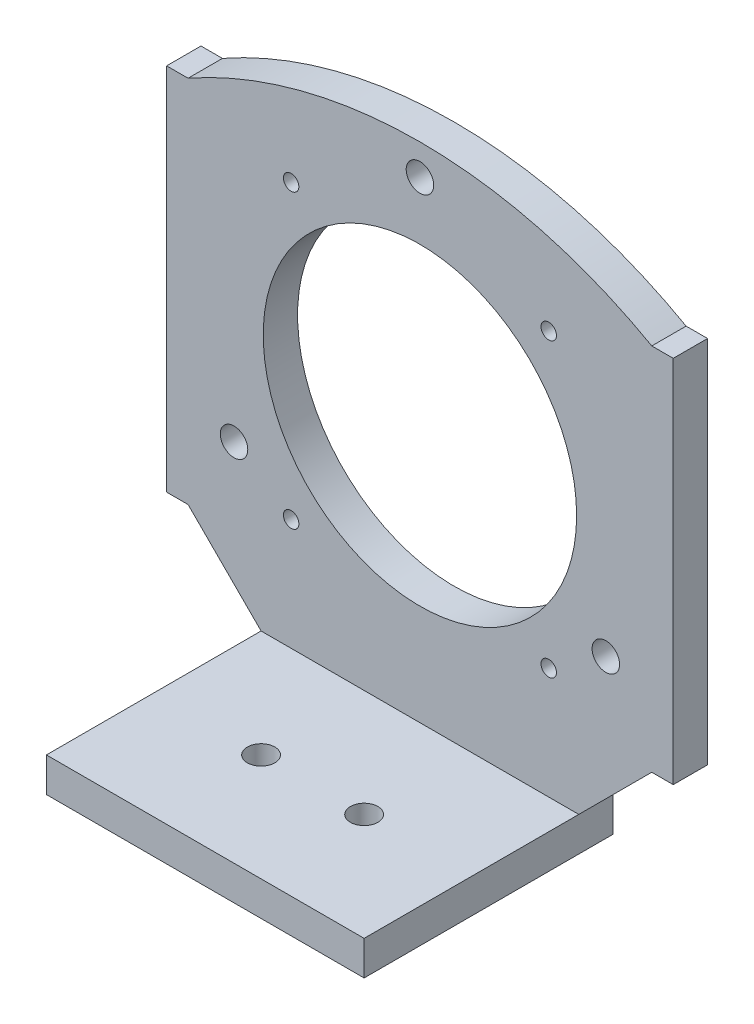
ISO-10303-21;
HEADER;
FILE_DESCRIPTION(('STEP AP214'),'2;1');
FILE_NAME('part.step','',(''),(''),'','','');
FILE_SCHEMA(('AUTOMOTIVE_DESIGN { 1 0 10303 214 1 1 1 1 }'));
ENDSEC;
DATA;
#1=APPLICATION_CONTEXT('core data for automotive mechanical design processes');
#2=APPLICATION_PROTOCOL_DEFINITION('international standard','automotive_design',2000,#1);
#3=PRODUCT_CONTEXT('',#1,'mechanical');
#4=PRODUCT('Part','Part','',(#3));
#5=PRODUCT_RELATED_PRODUCT_CATEGORY('part','',(#4));
#6=PRODUCT_DEFINITION_FORMATION('','',#4);
#7=PRODUCT_DEFINITION_CONTEXT('part definition',#1,'design');
#8=PRODUCT_DEFINITION('design','',#6,#7);
#9=PRODUCT_DEFINITION_SHAPE('','',#8);
#10=(LENGTH_UNIT() NAMED_UNIT(*) SI_UNIT(.MILLI.,.METRE.));
#11=(NAMED_UNIT(*) PLANE_ANGLE_UNIT() SI_UNIT($,.RADIAN.));
#12=(NAMED_UNIT(*) SI_UNIT($,.STERADIAN.) SOLID_ANGLE_UNIT());
#13=UNCERTAINTY_MEASURE_WITH_UNIT(LENGTH_MEASURE(1.E-05),#10,'distance_accuracy_value','');
#14=(GEOMETRIC_REPRESENTATION_CONTEXT(3) GLOBAL_UNCERTAINTY_ASSIGNED_CONTEXT((#13)) GLOBAL_UNIT_ASSIGNED_CONTEXT((#10,
#11,#12)) REPRESENTATION_CONTEXT('',''));
#15=CARTESIAN_POINT('',(0.,0.,0.));
#16=DIRECTION('',(0.,0.,1.));
#17=DIRECTION('',(1.,0.,0.));
#18=AXIS2_PLACEMENT_3D('',#15,#16,#17);
#19=CARTESIAN_POINT('',(0.,-26.4165942028438,4.));
#20=DIRECTION('',(0.,0.,-1.));
#21=DIRECTION('',(-1.,0.,0.));
#22=AXIS2_PLACEMENT_3D('',#19,#20,#21);
#23=PLANE('',#22);
#24=CARTESIAN_POINT('',(-15.,-17.,4.));
#25=DIRECTION('',(0.,0.,1.));
#26=DIRECTION('',(-1.,0.,0.));
#27=AXIS2_PLACEMENT_3D('',#24,#25,#26);
#28=CIRCLE('',#27,0.900000000000001);
#29=CARTESIAN_POINT('',(-15.9,-17.,4.));
#30=VERTEX_POINT('',#29);
#31=EDGE_CURVE('E241',#30,#30,#28,.T.);
#32=ORIENTED_EDGE('',*,*,#31,.F.);
#33=EDGE_LOOP('',(#32));
#34=FACE_BOUND('',#33,.T.);
#35=CARTESIAN_POINT('',(15.,-17.,4.));
#36=DIRECTION('',(0.,0.,1.));
#37=DIRECTION('',(1.,0.,0.));
#38=AXIS2_PLACEMENT_3D('',#35,#36,#37);
#39=CIRCLE('',#38,0.899999999999999);
#40=CARTESIAN_POINT('',(15.9,-17.,4.));
#41=VERTEX_POINT('',#40);
#42=EDGE_CURVE('E249',#41,#41,#39,.T.);
#43=ORIENTED_EDGE('',*,*,#42,.F.);
#44=EDGE_LOOP('',(#43));
#45=FACE_BOUND('',#44,.T.);
#46=CARTESIAN_POINT('',(15.,17.,4.));
#47=DIRECTION('',(0.,0.,1.));
#48=DIRECTION('',(-1.,0.,0.));
#49=AXIS2_PLACEMENT_3D('',#46,#47,#48);
#50=CIRCLE('',#49,0.899999999999999);
#51=CARTESIAN_POINT('',(14.1,17.,4.));
#52=VERTEX_POINT('',#51);
#53=EDGE_CURVE('E255',#52,#52,#50,.T.);
#54=ORIENTED_EDGE('',*,*,#53,.F.);
#55=EDGE_LOOP('',(#54));
#56=FACE_BOUND('',#55,.T.);
#57=CARTESIAN_POINT('',(-21.6506350946094,-12.5000000000009,4.));
#58=DIRECTION('',(0.,0.,1.));
#59=DIRECTION('',(1.,0.,0.));
#60=AXIS2_PLACEMENT_3D('',#57,#58,#59);
#61=CIRCLE('',#60,1.60000000000203);
#62=CARTESIAN_POINT('',(-20.0506350946073,-12.5000000000009,4.));
#63=VERTEX_POINT('',#62);
#64=EDGE_CURVE('E261',#63,#63,#61,.T.);
#65=ORIENTED_EDGE('',*,*,#64,.F.);
#66=EDGE_LOOP('',(#65));
#67=FACE_BOUND('',#66,.T.);
#68=CARTESIAN_POINT('',(21.6506350946126,-12.4999999999991,4.));
#69=DIRECTION('',(0.,0.,1.));
#70=DIRECTION('',(1.,0.,0.));
#71=AXIS2_PLACEMENT_3D('',#68,#69,#70);
#72=CIRCLE('',#71,1.60000000000137);
#73=CARTESIAN_POINT('',(23.2506350946139,-12.4999999999991,4.));
#74=VERTEX_POINT('',#73);
#75=EDGE_CURVE('E267',#74,#74,#72,.T.);
#76=ORIENTED_EDGE('',*,*,#75,.F.);
#77=EDGE_LOOP('',(#76));
#78=FACE_BOUND('',#77,.T.);
#79=CARTESIAN_POINT('',(-15.,17.,4.));
#80=DIRECTION('',(0.,0.,1.));
#81=DIRECTION('',(1.,0.,0.));
#82=AXIS2_PLACEMENT_3D('',#79,#80,#81);
#83=CIRCLE('',#82,0.900000000000001);
#84=CARTESIAN_POINT('',(-14.1,17.,4.));
#85=VERTEX_POINT('',#84);
#86=EDGE_CURVE('E273',#85,#85,#83,.T.);
#87=ORIENTED_EDGE('',*,*,#86,.F.);
#88=EDGE_LOOP('',(#87));
#89=FACE_BOUND('',#88,.T.);
#90=CARTESIAN_POINT('',(0.,25.,4.));
#91=DIRECTION('',(0.,0.,1.));
#92=DIRECTION('',(1.,0.,0.));
#93=AXIS2_PLACEMENT_3D('',#90,#91,#92);
#94=CIRCLE('',#93,1.6);
#95=CARTESIAN_POINT('',(1.6,25.,4.));
#96=VERTEX_POINT('',#95);
#97=EDGE_CURVE('E279',#96,#96,#94,.T.);
#98=ORIENTED_EDGE('',*,*,#97,.F.);
#99=EDGE_LOOP('',(#98));
#100=FACE_BOUND('',#99,.T.);
#101=CARTESIAN_POINT('',(0.,0.,4.));
#102=DIRECTION('',(0.,0.,1.));
#103=DIRECTION('',(1.,0.,0.));
#104=AXIS2_PLACEMENT_3D('',#101,#102,#103);
#105=CIRCLE('',#104,18.25);
#106=CARTESIAN_POINT('',(18.25,0.,4.));
#107=VERTEX_POINT('',#106);
#108=EDGE_CURVE('E154',#107,#107,#105,.T.);
#109=ORIENTED_EDGE('',*,*,#108,.F.);
#110=EDGE_LOOP('',(#109));
#111=FACE_BOUND('',#110,.T.);
#112=DIRECTION('',(-1.,0.,0.));
#113=VECTOR('',#112,1.);
#114=CARTESIAN_POINT('',(18.5,-30.,4.));
#115=LINE('',#114,#113);
#116=CARTESIAN_POINT('',(18.5,-30.,4.));
#117=VERTEX_POINT('',#116);
#118=CARTESIAN_POINT('',(-18.5,-30.,4.));
#119=VERTEX_POINT('',#118);
#120=EDGE_CURVE('E107',#117,#119,#115,.T.);
#121=ORIENTED_EDGE('',*,*,#120,.F.);
#122=DIRECTION('',(0.707106781186547,0.707106781186548,0.));
#123=VECTOR('',#122,1.);
#124=CARTESIAN_POINT('',(18.5,-30.,4.));
#125=LINE('',#124,#123);
#126=CARTESIAN_POINT('',(27.,-21.5,4.));
#127=VERTEX_POINT('',#126);
#128=EDGE_CURVE('E222',#117,#127,#125,.T.);
#129=ORIENTED_EDGE('',*,*,#128,.T.);
#130=DIRECTION('',(1.,0.,0.));
#131=VECTOR('',#130,1.);
#132=CARTESIAN_POINT('',(27.,-21.5,4.));
#133=LINE('',#132,#131);
#134=CARTESIAN_POINT('',(29.5,-21.5,4.));
#135=VERTEX_POINT('',#134);
#136=EDGE_CURVE('E225',#127,#135,#133,.T.);
#137=ORIENTED_EDGE('',*,*,#136,.T.);
#138=DIRECTION('',(0.,1.,0.));
#139=VECTOR('',#138,1.);
#140=CARTESIAN_POINT('',(29.5,-21.5,4.));
#141=LINE('',#140,#139);
#142=CARTESIAN_POINT('',(29.5,21.5,4.));
#143=VERTEX_POINT('',#142);
#144=EDGE_CURVE('E291',#135,#143,#141,.T.);
#145=ORIENTED_EDGE('',*,*,#144,.T.);
#146=DIRECTION('',(-1.,0.,0.));
#147=VECTOR('',#146,1.);
#148=CARTESIAN_POINT('',(29.5,21.5,4.));
#149=LINE('',#148,#147);
#150=CARTESIAN_POINT('',(27.,21.5,4.));
#151=VERTEX_POINT('',#150);
#152=EDGE_CURVE('E293',#143,#151,#149,.T.);
#153=ORIENTED_EDGE('',*,*,#152,.T.);
#154=CARTESIAN_POINT('',(0.,-26.4165942028438,4.));
#155=DIRECTION('',(0.,0.,1.));
#156=DIRECTION('',(-1.,0.,0.));
#157=AXIS2_PLACEMENT_3D('',#154,#155,#156);
#158=CIRCLE('',#157,55.);
#159=CARTESIAN_POINT('',(-27.,21.5,4.));
#160=VERTEX_POINT('',#159);
#161=EDGE_CURVE('E132',#151,#160,#158,.T.);
#162=ORIENTED_EDGE('',*,*,#161,.T.);
#163=DIRECTION('',(-1.,0.,0.));
#164=VECTOR('',#163,1.);
#165=CARTESIAN_POINT('',(-29.5,21.5,4.));
#166=LINE('',#165,#164);
#167=CARTESIAN_POINT('',(-29.5,21.5,4.));
#168=VERTEX_POINT('',#167);
#169=EDGE_CURVE('E127',#160,#168,#166,.T.);
#170=ORIENTED_EDGE('',*,*,#169,.T.);
#171=DIRECTION('',(0.,-1.,0.));
#172=VECTOR('',#171,1.);
#173=CARTESIAN_POINT('',(-29.5,-21.5,4.));
#174=LINE('',#173,#172);
#175=CARTESIAN_POINT('',(-29.5,-21.5,4.));
#176=VERTEX_POINT('',#175);
#177=EDGE_CURVE('E130',#168,#176,#174,.T.);
#178=ORIENTED_EDGE('',*,*,#177,.T.);
#179=DIRECTION('',(1.,0.,0.));
#180=VECTOR('',#179,1.);
#181=CARTESIAN_POINT('',(-27.,-21.5,4.));
#182=LINE('',#181,#180);
#183=CARTESIAN_POINT('',(-27.,-21.5,4.));
#184=VERTEX_POINT('',#183);
#185=EDGE_CURVE('E52',#176,#184,#182,.T.);
#186=ORIENTED_EDGE('',*,*,#185,.T.);
#187=DIRECTION('',(0.707106781186548,-0.707106781186547,0.));
#188=VECTOR('',#187,1.);
#189=CARTESIAN_POINT('',(-18.5,-30.,4.));
#190=LINE('',#189,#188);
#191=EDGE_CURVE('E173',#184,#119,#190,.T.);
#192=ORIENTED_EDGE('',*,*,#191,.T.);
#193=EDGE_LOOP('',(#121,#129,#137,#145,#153,#162,#170,#178,#186,#192));
#194=FACE_BOUND('',#193,.T.);
#195=ADVANCED_FACE('F35',(#34,#45,#56,#67,#78,#89,#100,#111,#194),#23,.F.);
#196=CARTESIAN_POINT('',(0.,-26.4165942028438,0.));
#197=DIRECTION('',(0.,0.,-1.));
#198=DIRECTION('',(-1.,0.,0.));
#199=AXIS2_PLACEMENT_3D('',#196,#197,#198);
#200=PLANE('',#199);
#201=CARTESIAN_POINT('',(15.,-17.,0.));
#202=DIRECTION('',(0.,0.,1.));
#203=DIRECTION('',(1.,0.,0.));
#204=AXIS2_PLACEMENT_3D('',#201,#202,#203);
#205=CIRCLE('',#204,0.899999999999999);
#206=CARTESIAN_POINT('',(15.9,-17.,0.));
#207=VERTEX_POINT('',#206);
#208=EDGE_CURVE('E247',#207,#207,#205,.T.);
#209=ORIENTED_EDGE('',*,*,#208,.T.);
#210=EDGE_LOOP('',(#209));
#211=FACE_BOUND('',#210,.T.);
#212=CARTESIAN_POINT('',(-21.6506350946094,-12.5000000000009,0.));
#213=DIRECTION('',(0.,0.,1.));
#214=DIRECTION('',(1.,0.,0.));
#215=AXIS2_PLACEMENT_3D('',#212,#213,#214);
#216=CIRCLE('',#215,1.60000000000203);
#217=CARTESIAN_POINT('',(-20.0506350946073,-12.5000000000009,0.));
#218=VERTEX_POINT('',#217);
#219=EDGE_CURVE('E258',#218,#218,#216,.T.);
#220=ORIENTED_EDGE('',*,*,#219,.T.);
#221=EDGE_LOOP('',(#220));
#222=FACE_BOUND('',#221,.T.);
#223=CARTESIAN_POINT('',(-15.,17.,0.));
#224=DIRECTION('',(0.,0.,1.));
#225=DIRECTION('',(1.,0.,0.));
#226=AXIS2_PLACEMENT_3D('',#223,#224,#225);
#227=CIRCLE('',#226,0.900000000000001);
#228=CARTESIAN_POINT('',(-14.1,17.,0.));
#229=VERTEX_POINT('',#228);
#230=EDGE_CURVE('E270',#229,#229,#227,.T.);
#231=ORIENTED_EDGE('',*,*,#230,.T.);
#232=EDGE_LOOP('',(#231));
#233=FACE_BOUND('',#232,.T.);
#234=CARTESIAN_POINT('',(0.,0.,0.));
#235=DIRECTION('',(0.,0.,1.));
#236=DIRECTION('',(1.,0.,0.));
#237=AXIS2_PLACEMENT_3D('',#234,#235,#236);
#238=CIRCLE('',#237,18.25);
#239=CARTESIAN_POINT('',(18.25,0.,0.));
#240=VERTEX_POINT('',#239);
#241=EDGE_CURVE('E282',#240,#240,#238,.T.);
#242=ORIENTED_EDGE('',*,*,#241,.T.);
#243=EDGE_LOOP('',(#242));
#244=FACE_BOUND('',#243,.T.);
#245=DIRECTION('',(0.707106781186548,-0.707106781186547,0.));
#246=VECTOR('',#245,1.);
#247=CARTESIAN_POINT('',(-18.5,-30.,0.));
#248=LINE('',#247,#246);
#249=CARTESIAN_POINT('',(-27.,-21.5,0.));
#250=VERTEX_POINT('',#249);
#251=CARTESIAN_POINT('',(-18.5,-30.,0.));
#252=VERTEX_POINT('',#251);
#253=EDGE_CURVE('E150',#250,#252,#248,.T.);
#254=ORIENTED_EDGE('',*,*,#253,.F.);
#255=DIRECTION('',(1.,0.,0.));
#256=VECTOR('',#255,1.);
#257=CARTESIAN_POINT('',(-27.,-21.5,0.));
#258=LINE('',#257,#256);
#259=CARTESIAN_POINT('',(-29.5,-21.5,0.));
#260=VERTEX_POINT('',#259);
#261=EDGE_CURVE('E100',#260,#250,#258,.T.);
#262=ORIENTED_EDGE('',*,*,#261,.F.);
#263=DIRECTION('',(0.,-1.,0.));
#264=VECTOR('',#263,1.);
#265=CARTESIAN_POINT('',(-29.5,-21.5,0.));
#266=LINE('',#265,#264);
#267=CARTESIAN_POINT('',(-29.5,21.5,0.));
#268=VERTEX_POINT('',#267);
#269=EDGE_CURVE('E94',#268,#260,#266,.T.);
#270=ORIENTED_EDGE('',*,*,#269,.F.);
#271=DIRECTION('',(-1.,0.,0.));
#272=VECTOR('',#271,1.);
#273=CARTESIAN_POINT('',(-29.5,21.5,0.));
#274=LINE('',#273,#272);
#275=CARTESIAN_POINT('',(-27.,21.5,0.));
#276=VERTEX_POINT('',#275);
#277=EDGE_CURVE('E140',#276,#268,#274,.T.);
#278=ORIENTED_EDGE('',*,*,#277,.F.);
#279=CARTESIAN_POINT('',(0.,-26.4165942028438,0.));
#280=DIRECTION('',(0.,0.,1.));
#281=DIRECTION('',(-1.,0.,0.));
#282=AXIS2_PLACEMENT_3D('',#279,#280,#281);
#283=CIRCLE('',#282,55.);
#284=CARTESIAN_POINT('',(27.,21.5,0.));
#285=VERTEX_POINT('',#284);
#286=EDGE_CURVE('E168',#285,#276,#283,.T.);
#287=ORIENTED_EDGE('',*,*,#286,.F.);
#288=DIRECTION('',(-1.,0.,0.));
#289=VECTOR('',#288,1.);
#290=CARTESIAN_POINT('',(29.5,21.5,0.));
#291=LINE('',#290,#289);
#292=CARTESIAN_POINT('',(29.5,21.5,0.));
#293=VERTEX_POINT('',#292);
#294=EDGE_CURVE('E166',#293,#285,#291,.T.);
#295=ORIENTED_EDGE('',*,*,#294,.F.);
#296=DIRECTION('',(0.,1.,0.));
#297=VECTOR('',#296,1.);
#298=CARTESIAN_POINT('',(29.5,-21.5,0.));
#299=LINE('',#298,#297);
#300=CARTESIAN_POINT('',(29.5,-21.5,0.));
#301=VERTEX_POINT('',#300);
#302=EDGE_CURVE('E164',#301,#293,#299,.T.);
#303=ORIENTED_EDGE('',*,*,#302,.F.);
#304=DIRECTION('',(1.,0.,0.));
#305=VECTOR('',#304,1.);
#306=CARTESIAN_POINT('',(27.,-21.5,0.));
#307=LINE('',#306,#305);
#308=CARTESIAN_POINT('',(27.,-21.5,0.));
#309=VERTEX_POINT('',#308);
#310=EDGE_CURVE('E162',#309,#301,#307,.T.);
#311=ORIENTED_EDGE('',*,*,#310,.F.);
#312=DIRECTION('',(0.707106781186547,0.707106781186548,0.));
#313=VECTOR('',#312,1.);
#314=CARTESIAN_POINT('',(18.5,-30.,0.));
#315=LINE('',#314,#313);
#316=CARTESIAN_POINT('',(18.5,-30.,0.));
#317=VERTEX_POINT('',#316);
#318=EDGE_CURVE('E160',#317,#309,#315,.T.);
#319=ORIENTED_EDGE('',*,*,#318,.F.);
#320=DIRECTION('',(0.,1.,0.));
#321=VECTOR('',#320,1.);
#322=CARTESIAN_POINT('',(18.5,-34.,0.));
#323=LINE('',#322,#321);
#324=CARTESIAN_POINT('',(18.5,-34.,0.));
#325=VERTEX_POINT('',#324);
#326=EDGE_CURVE('E158',#325,#317,#323,.T.);
#327=ORIENTED_EDGE('',*,*,#326,.F.);
#328=DIRECTION('',(1.,0.,0.));
#329=VECTOR('',#328,1.);
#330=CARTESIAN_POINT('',(-18.5,-34.,0.));
#331=LINE('',#330,#329);
#332=CARTESIAN_POINT('',(-18.5,-34.,0.));
#333=VERTEX_POINT('',#332);
#334=EDGE_CURVE('E156',#333,#325,#331,.T.);
#335=ORIENTED_EDGE('',*,*,#334,.F.);
#336=DIRECTION('',(0.,-1.,0.));
#337=VECTOR('',#336,1.);
#338=CARTESIAN_POINT('',(-18.5,-34.,0.));
#339=LINE('',#338,#337);
#340=EDGE_CURVE('E153',#252,#333,#339,.T.);
#341=ORIENTED_EDGE('',*,*,#340,.F.);
#342=EDGE_LOOP('',(#254,#262,#270,#278,#287,#295,#303,#311,#319,#327,#335,#341));
#343=FACE_BOUND('',#342,.T.);
#344=CARTESIAN_POINT('',(0.,25.,0.));
#345=DIRECTION('',(0.,0.,1.));
#346=DIRECTION('',(1.,0.,0.));
#347=AXIS2_PLACEMENT_3D('',#344,#345,#346);
#348=CIRCLE('',#347,1.6);
#349=CARTESIAN_POINT('',(1.6,25.,0.));
#350=VERTEX_POINT('',#349);
#351=EDGE_CURVE('E276',#350,#350,#348,.T.);
#352=ORIENTED_EDGE('',*,*,#351,.T.);
#353=EDGE_LOOP('',(#352));
#354=FACE_BOUND('',#353,.T.);
#355=CARTESIAN_POINT('',(21.6506350946126,-12.4999999999991,0.));
#356=DIRECTION('',(0.,0.,1.));
#357=DIRECTION('',(1.,0.,0.));
#358=AXIS2_PLACEMENT_3D('',#355,#356,#357);
#359=CIRCLE('',#358,1.60000000000137);
#360=CARTESIAN_POINT('',(23.2506350946139,-12.4999999999991,0.));
#361=VERTEX_POINT('',#360);
#362=EDGE_CURVE('E264',#361,#361,#359,.T.);
#363=ORIENTED_EDGE('',*,*,#362,.T.);
#364=EDGE_LOOP('',(#363));
#365=FACE_BOUND('',#364,.T.);
#366=CARTESIAN_POINT('',(15.,17.,0.));
#367=DIRECTION('',(0.,0.,1.));
#368=DIRECTION('',(-1.,0.,0.));
#369=AXIS2_PLACEMENT_3D('',#366,#367,#368);
#370=CIRCLE('',#369,0.899999999999999);
#371=CARTESIAN_POINT('',(14.1,17.,0.));
#372=VERTEX_POINT('',#371);
#373=EDGE_CURVE('E252',#372,#372,#370,.T.);
#374=ORIENTED_EDGE('',*,*,#373,.T.);
#375=EDGE_LOOP('',(#374));
#376=FACE_BOUND('',#375,.T.);
#377=CARTESIAN_POINT('',(-15.,-17.,0.));
#378=DIRECTION('',(0.,0.,1.));
#379=DIRECTION('',(-1.,0.,0.));
#380=AXIS2_PLACEMENT_3D('',#377,#378,#379);
#381=CIRCLE('',#380,0.900000000000001);
#382=CARTESIAN_POINT('',(-15.9,-17.,0.));
#383=VERTEX_POINT('',#382);
#384=EDGE_CURVE('E237',#383,#383,#381,.T.);
#385=ORIENTED_EDGE('',*,*,#384,.T.);
#386=EDGE_LOOP('',(#385));
#387=FACE_BOUND('',#386,.T.);
#388=ADVANCED_FACE('F210',(#211,#222,#233,#244,#343,#354,#365,#376,#387),#200,.T.);
#389=CARTESIAN_POINT('',(-18.5,-30.,4.));
#390=DIRECTION('',(0.707106781186547,0.707106781186548,0.));
#391=DIRECTION('',(-0.707106781186548,0.707106781186547,0.));
#392=AXIS2_PLACEMENT_3D('',#389,#390,#391);
#393=PLANE('',#392);
#394=ORIENTED_EDGE('',*,*,#253,.T.);
#395=DIRECTION('',(0.,0.,-1.));
#396=VECTOR('',#395,1.);
#397=CARTESIAN_POINT('',(-18.5,-30.,4.));
#398=LINE('',#397,#396);
#399=EDGE_CURVE('E11',#119,#252,#398,.T.);
#400=ORIENTED_EDGE('',*,*,#399,.F.);
#401=ORIENTED_EDGE('',*,*,#191,.F.);
#402=DIRECTION('',(0.,0.,-1.));
#403=VECTOR('',#402,1.);
#404=CARTESIAN_POINT('',(-27.,-21.5,4.));
#405=LINE('',#404,#403);
#406=EDGE_CURVE('E146',#184,#250,#405,.T.);
#407=ORIENTED_EDGE('',*,*,#406,.T.);
#408=EDGE_LOOP('',(#394,#400,#401,#407));
#409=FACE_BOUND('',#408,.T.);
#410=ADVANCED_FACE('F37',(#409),#393,.F.);
#411=CARTESIAN_POINT('',(-18.5,-34.,4.));
#412=DIRECTION('',(1.,0.,0.));
#413=DIRECTION('',(0.,1.,0.));
#414=AXIS2_PLACEMENT_3D('',#411,#412,#413);
#415=PLANE('',#414);
#416=ORIENTED_EDGE('',*,*,#340,.T.);
#417=DIRECTION('',(0.,0.,-1.));
#418=VECTOR('',#417,1.);
#419=CARTESIAN_POINT('',(-18.5,-34.,4.));
#420=LINE('',#419,#418);
#421=CARTESIAN_POINT('',(-18.5,-34.,29.));
#422=VERTEX_POINT('',#421);
#423=EDGE_CURVE('E44',#422,#333,#420,.T.);
#424=ORIENTED_EDGE('',*,*,#423,.F.);
#425=DIRECTION('',(0.,-1.,0.));
#426=VECTOR('',#425,1.);
#427=CARTESIAN_POINT('',(-18.5,-30.,29.));
#428=LINE('',#427,#426);
#429=CARTESIAN_POINT('',(-18.5,-30.,29.));
#430=VERTEX_POINT('',#429);
#431=EDGE_CURVE('E392',#430,#422,#428,.T.);
#432=ORIENTED_EDGE('',*,*,#431,.F.);
#433=DIRECTION('',(0.,0.,-1.));
#434=VECTOR('',#433,1.);
#435=CARTESIAN_POINT('',(-18.5,-30.,29.));
#436=LINE('',#435,#434);
#437=EDGE_CURVE('E238',#430,#119,#436,.T.);
#438=ORIENTED_EDGE('',*,*,#437,.T.);
#439=ORIENTED_EDGE('',*,*,#399,.T.);
#440=EDGE_LOOP('',(#416,#424,#432,#438,#439));
#441=FACE_BOUND('',#440,.T.);
#442=ADVANCED_FACE('F398',(#441),#415,.F.);
#443=CARTESIAN_POINT('',(-18.5,-34.,4.));
#444=DIRECTION('',(0.,1.,0.));
#445=DIRECTION('',(-1.,0.,0.));
#446=AXIS2_PLACEMENT_3D('',#443,#444,#445);
#447=PLANE('',#446);
#448=CARTESIAN_POINT('',(-5.99999999999999,-34.,16.5));
#449=DIRECTION('',(0.,1.,0.));
#450=DIRECTION('',(-1.,0.,0.));
#451=AXIS2_PLACEMENT_3D('',#448,#449,#450);
#452=CIRCLE('',#451,1.6);
#453=CARTESIAN_POINT('',(-7.6,-34.,16.5));
#454=VERTEX_POINT('',#453);
#455=EDGE_CURVE('E376',#454,#454,#452,.T.);
#456=ORIENTED_EDGE('',*,*,#455,.T.);
#457=EDGE_LOOP('',(#456));
#458=FACE_BOUND('',#457,.T.);
#459=CARTESIAN_POINT('',(6.00000000000001,-34.,16.5));
#460=DIRECTION('',(0.,1.,0.));
#461=DIRECTION('',(1.,0.,0.));
#462=AXIS2_PLACEMENT_3D('',#459,#460,#461);
#463=CIRCLE('',#462,1.6);
#464=CARTESIAN_POINT('',(7.6,-34.,16.5));
#465=VERTEX_POINT('',#464);
#466=EDGE_CURVE('E380',#465,#465,#463,.T.);
#467=ORIENTED_EDGE('',*,*,#466,.T.);
#468=EDGE_LOOP('',(#467));
#469=FACE_BOUND('',#468,.T.);
#470=ORIENTED_EDGE('',*,*,#334,.T.);
#471=DIRECTION('',(0.,0.,-1.));
#472=VECTOR('',#471,1.);
#473=CARTESIAN_POINT('',(18.5,-34.,4.));
#474=LINE('',#473,#472);
#475=CARTESIAN_POINT('',(18.5,-34.,29.));
#476=VERTEX_POINT('',#475);
#477=EDGE_CURVE('E192',#476,#325,#474,.T.);
#478=ORIENTED_EDGE('',*,*,#477,.F.);
#479=DIRECTION('',(1.,0.,0.));
#480=VECTOR('',#479,1.);
#481=CARTESIAN_POINT('',(-18.5,-34.,29.));
#482=LINE('',#481,#480);
#483=EDGE_CURVE('E203',#422,#476,#482,.T.);
#484=ORIENTED_EDGE('',*,*,#483,.F.);
#485=ORIENTED_EDGE('',*,*,#423,.T.);
#486=EDGE_LOOP('',(#470,#478,#484,#485));
#487=FACE_BOUND('',#486,.T.);
#488=ADVANCED_FACE('F199',(#458,#469,#487),#447,.F.);
#489=CARTESIAN_POINT('',(18.5,-34.,4.));
#490=DIRECTION('',(-1.,0.,0.));
#491=DIRECTION('',(0.,-1.,0.));
#492=AXIS2_PLACEMENT_3D('',#489,#490,#491);
#493=PLANE('',#492);
#494=ORIENTED_EDGE('',*,*,#326,.T.);
#495=DIRECTION('',(0.,0.,-1.));
#496=VECTOR('',#495,1.);
#497=CARTESIAN_POINT('',(18.5,-30.,4.));
#498=LINE('',#497,#496);
#499=EDGE_CURVE('E189',#117,#317,#498,.T.);
#500=ORIENTED_EDGE('',*,*,#499,.F.);
#501=DIRECTION('',(0.,0.,-1.));
#502=VECTOR('',#501,1.);
#503=CARTESIAN_POINT('',(18.5,-30.,29.));
#504=LINE('',#503,#502);
#505=CARTESIAN_POINT('',(18.5,-30.,29.));
#506=VERTEX_POINT('',#505);
#507=EDGE_CURVE('E229',#506,#117,#504,.T.);
#508=ORIENTED_EDGE('',*,*,#507,.F.);
#509=DIRECTION('',(0.,1.,0.));
#510=VECTOR('',#509,1.);
#511=CARTESIAN_POINT('',(18.5,-34.,29.));
#512=LINE('',#511,#510);
#513=EDGE_CURVE('E389',#476,#506,#512,.T.);
#514=ORIENTED_EDGE('',*,*,#513,.F.);
#515=ORIENTED_EDGE('',*,*,#477,.T.);
#516=EDGE_LOOP('',(#494,#500,#508,#514,#515));
#517=FACE_BOUND('',#516,.T.);
#518=ADVANCED_FACE('F215',(#517),#493,.F.);
#519=CARTESIAN_POINT('',(18.5,-30.,4.));
#520=DIRECTION('',(-0.707106781186548,0.707106781186547,0.));
#521=DIRECTION('',(-0.707106781186547,-0.707106781186548,0.));
#522=AXIS2_PLACEMENT_3D('',#519,#520,#521);
#523=PLANE('',#522);
#524=ORIENTED_EDGE('',*,*,#318,.T.);
#525=DIRECTION('',(0.,0.,-1.));
#526=VECTOR('',#525,1.);
#527=CARTESIAN_POINT('',(27.,-21.5,4.));
#528=LINE('',#527,#526);
#529=EDGE_CURVE('E186',#127,#309,#528,.T.);
#530=ORIENTED_EDGE('',*,*,#529,.F.);
#531=ORIENTED_EDGE('',*,*,#128,.F.);
#532=ORIENTED_EDGE('',*,*,#499,.T.);
#533=EDGE_LOOP('',(#524,#530,#531,#532));
#534=FACE_BOUND('',#533,.T.);
#535=ADVANCED_FACE('F220',(#534),#523,.F.);
#536=CARTESIAN_POINT('',(27.,-21.5,4.));
#537=DIRECTION('',(0.,1.,0.));
#538=DIRECTION('',(-1.,0.,0.));
#539=AXIS2_PLACEMENT_3D('',#536,#537,#538);
#540=PLANE('',#539);
#541=ORIENTED_EDGE('',*,*,#310,.T.);
#542=DIRECTION('',(0.,0.,-1.));
#543=VECTOR('',#542,1.);
#544=CARTESIAN_POINT('',(29.5,-21.5,4.));
#545=LINE('',#544,#543);
#546=EDGE_CURVE('E183',#135,#301,#545,.T.);
#547=ORIENTED_EDGE('',*,*,#546,.F.);
#548=ORIENTED_EDGE('',*,*,#136,.F.);
#549=ORIENTED_EDGE('',*,*,#529,.T.);
#550=EDGE_LOOP('',(#541,#547,#548,#549));
#551=FACE_BOUND('',#550,.T.);
#552=ADVANCED_FACE('F411',(#551),#540,.F.);
#553=CARTESIAN_POINT('',(29.5,-21.5,4.));
#554=DIRECTION('',(-1.,0.,0.));
#555=DIRECTION('',(0.,-1.,0.));
#556=AXIS2_PLACEMENT_3D('',#553,#554,#555);
#557=PLANE('',#556);
#558=ORIENTED_EDGE('',*,*,#302,.T.);
#559=DIRECTION('',(0.,0.,-1.));
#560=VECTOR('',#559,1.);
#561=CARTESIAN_POINT('',(29.5,21.5,4.));
#562=LINE('',#561,#560);
#563=EDGE_CURVE('E180',#143,#293,#562,.T.);
#564=ORIENTED_EDGE('',*,*,#563,.F.);
#565=ORIENTED_EDGE('',*,*,#144,.F.);
#566=ORIENTED_EDGE('',*,*,#546,.T.);
#567=EDGE_LOOP('',(#558,#564,#565,#566));
#568=FACE_BOUND('',#567,.T.);
#569=ADVANCED_FACE('F414',(#568),#557,.F.);
#570=CARTESIAN_POINT('',(29.5,21.5,4.));
#571=DIRECTION('',(0.,-1.,0.));
#572=DIRECTION('',(1.,0.,0.));
#573=AXIS2_PLACEMENT_3D('',#570,#571,#572);
#574=PLANE('',#573);
#575=ORIENTED_EDGE('',*,*,#294,.T.);
#576=DIRECTION('',(0.,0.,-1.));
#577=VECTOR('',#576,1.);
#578=CARTESIAN_POINT('',(27.,21.5,4.));
#579=LINE('',#578,#577);
#580=EDGE_CURVE('E177',#151,#285,#579,.T.);
#581=ORIENTED_EDGE('',*,*,#580,.F.);
#582=ORIENTED_EDGE('',*,*,#152,.F.);
#583=ORIENTED_EDGE('',*,*,#563,.T.);
#584=EDGE_LOOP('',(#575,#581,#582,#583));
#585=FACE_BOUND('',#584,.T.);
#586=ADVANCED_FACE('F299',(#585),#574,.F.);
#587=CARTESIAN_POINT('',(0.,-26.4165942028438,4.));
#588=DIRECTION('',(0.,0.,-1.));
#589=DIRECTION('',(-1.,0.,0.));
#590=AXIS2_PLACEMENT_3D('',#587,#588,#589);
#591=CYLINDRICAL_SURFACE('',#590,55.);
#592=ORIENTED_EDGE('',*,*,#286,.T.);
#593=DIRECTION('',(0.,0.,-1.));
#594=VECTOR('',#593,1.);
#595=CARTESIAN_POINT('',(-27.,21.5,4.));
#596=LINE('',#595,#594);
#597=EDGE_CURVE('E141',#160,#276,#596,.T.);
#598=ORIENTED_EDGE('',*,*,#597,.F.);
#599=ORIENTED_EDGE('',*,*,#161,.F.);
#600=ORIENTED_EDGE('',*,*,#580,.T.);
#601=EDGE_LOOP('',(#592,#598,#599,#600));
#602=FACE_BOUND('',#601,.T.);
#603=ADVANCED_FACE('F303',(#602),#591,.T.);
#604=CARTESIAN_POINT('',(-29.5,21.5,4.));
#605=DIRECTION('',(0.,-1.,0.));
#606=DIRECTION('',(1.,0.,0.));
#607=AXIS2_PLACEMENT_3D('',#604,#605,#606);
#608=PLANE('',#607);
#609=ORIENTED_EDGE('',*,*,#277,.T.);
#610=DIRECTION('',(0.,0.,-1.));
#611=VECTOR('',#610,1.);
#612=CARTESIAN_POINT('',(-29.5,21.5,4.));
#613=LINE('',#612,#611);
#614=EDGE_CURVE('E137',#168,#268,#613,.T.);
#615=ORIENTED_EDGE('',*,*,#614,.F.);
#616=ORIENTED_EDGE('',*,*,#169,.F.);
#617=ORIENTED_EDGE('',*,*,#597,.T.);
#618=EDGE_LOOP('',(#609,#615,#616,#617));
#619=FACE_BOUND('',#618,.T.);
#620=ADVANCED_FACE('F138',(#619),#608,.F.);
#621=CARTESIAN_POINT('',(-29.5,-21.5,4.));
#622=DIRECTION('',(1.,0.,0.));
#623=DIRECTION('',(0.,1.,0.));
#624=AXIS2_PLACEMENT_3D('',#621,#622,#623);
#625=PLANE('',#624);
#626=ORIENTED_EDGE('',*,*,#269,.T.);
#627=DIRECTION('',(0.,0.,-1.));
#628=VECTOR('',#627,1.);
#629=CARTESIAN_POINT('',(-29.5,-21.5,4.));
#630=LINE('',#629,#628);
#631=EDGE_CURVE('E142',#176,#260,#630,.T.);
#632=ORIENTED_EDGE('',*,*,#631,.F.);
#633=ORIENTED_EDGE('',*,*,#177,.F.);
#634=ORIENTED_EDGE('',*,*,#614,.T.);
#635=EDGE_LOOP('',(#626,#632,#633,#634));
#636=FACE_BOUND('',#635,.T.);
#637=ADVANCED_FACE('F144',(#636),#625,.F.);
#638=CARTESIAN_POINT('',(-27.,-21.5,4.));
#639=DIRECTION('',(0.,1.,0.));
#640=DIRECTION('',(-1.,0.,0.));
#641=AXIS2_PLACEMENT_3D('',#638,#639,#640);
#642=PLANE('',#641);
#643=ORIENTED_EDGE('',*,*,#261,.T.);
#644=ORIENTED_EDGE('',*,*,#406,.F.);
#645=ORIENTED_EDGE('',*,*,#185,.F.);
#646=ORIENTED_EDGE('',*,*,#631,.T.);
#647=EDGE_LOOP('',(#643,#644,#645,#646));
#648=FACE_BOUND('',#647,.T.);
#649=ADVANCED_FACE('F307',(#648),#642,.F.);
#650=CARTESIAN_POINT('',(0.,0.,4.));
#651=DIRECTION('',(0.,0.,-1.));
#652=DIRECTION('',(-1.,0.,0.));
#653=AXIS2_PLACEMENT_3D('',#650,#651,#652);
#654=CYLINDRICAL_SURFACE('',#653,18.25);
#655=ORIENTED_EDGE('',*,*,#108,.T.);
#656=EDGE_LOOP('',(#655));
#657=FACE_BOUND('',#656,.T.);
#658=ORIENTED_EDGE('',*,*,#241,.F.);
#659=EDGE_LOOP('',(#658));
#660=FACE_BOUND('',#659,.T.);
#661=ADVANCED_FACE('F309',(#657,#660),#654,.F.);
#662=CARTESIAN_POINT('',(0.,25.,4.));
#663=DIRECTION('',(0.,0.,-1.));
#664=DIRECTION('',(-1.,0.,0.));
#665=AXIS2_PLACEMENT_3D('',#662,#663,#664);
#666=CYLINDRICAL_SURFACE('',#665,1.6);
#667=ORIENTED_EDGE('',*,*,#97,.T.);
#668=EDGE_LOOP('',(#667));
#669=FACE_BOUND('',#668,.T.);
#670=ORIENTED_EDGE('',*,*,#351,.F.);
#671=EDGE_LOOP('',(#670));
#672=FACE_BOUND('',#671,.T.);
#673=ADVANCED_FACE('F315',(#669,#672),#666,.F.);
#674=CARTESIAN_POINT('',(-15.,17.,4.));
#675=DIRECTION('',(0.,0.,-1.));
#676=DIRECTION('',(-1.,0.,0.));
#677=AXIS2_PLACEMENT_3D('',#674,#675,#676);
#678=CYLINDRICAL_SURFACE('',#677,0.900000000000001);
#679=ORIENTED_EDGE('',*,*,#86,.T.);
#680=EDGE_LOOP('',(#679));
#681=FACE_BOUND('',#680,.T.);
#682=ORIENTED_EDGE('',*,*,#230,.F.);
#683=EDGE_LOOP('',(#682));
#684=FACE_BOUND('',#683,.T.);
#685=ADVANCED_FACE('F332',(#681,#684),#678,.F.);
#686=CARTESIAN_POINT('',(21.6506350946126,-12.4999999999991,4.));
#687=DIRECTION('',(0.,0.,-1.));
#688=DIRECTION('',(-1.,0.,0.));
#689=AXIS2_PLACEMENT_3D('',#686,#687,#688);
#690=CYLINDRICAL_SURFACE('',#689,1.60000000000137);
#691=ORIENTED_EDGE('',*,*,#75,.T.);
#692=EDGE_LOOP('',(#691));
#693=FACE_BOUND('',#692,.T.);
#694=ORIENTED_EDGE('',*,*,#362,.F.);
#695=EDGE_LOOP('',(#694));
#696=FACE_BOUND('',#695,.T.);
#697=ADVANCED_FACE('F336',(#693,#696),#690,.F.);
#698=CARTESIAN_POINT('',(-21.6506350946094,-12.5000000000009,4.));
#699=DIRECTION('',(0.,0.,-1.));
#700=DIRECTION('',(-1.,0.,0.));
#701=AXIS2_PLACEMENT_3D('',#698,#699,#700);
#702=CYLINDRICAL_SURFACE('',#701,1.60000000000203);
#703=ORIENTED_EDGE('',*,*,#64,.T.);
#704=EDGE_LOOP('',(#703));
#705=FACE_BOUND('',#704,.T.);
#706=ORIENTED_EDGE('',*,*,#219,.F.);
#707=EDGE_LOOP('',(#706));
#708=FACE_BOUND('',#707,.T.);
#709=ADVANCED_FACE('F340',(#705,#708),#702,.F.);
#710=CARTESIAN_POINT('',(15.,17.,4.));
#711=DIRECTION('',(0.,0.,-1.));
#712=DIRECTION('',(-1.,0.,0.));
#713=AXIS2_PLACEMENT_3D('',#710,#711,#712);
#714=CYLINDRICAL_SURFACE('',#713,0.899999999999999);
#715=ORIENTED_EDGE('',*,*,#53,.T.);
#716=EDGE_LOOP('',(#715));
#717=FACE_BOUND('',#716,.T.);
#718=ORIENTED_EDGE('',*,*,#373,.F.);
#719=EDGE_LOOP('',(#718));
#720=FACE_BOUND('',#719,.T.);
#721=ADVANCED_FACE('F344',(#717,#720),#714,.F.);
#722=CARTESIAN_POINT('',(15.,-17.,4.));
#723=DIRECTION('',(0.,0.,-1.));
#724=DIRECTION('',(-1.,0.,0.));
#725=AXIS2_PLACEMENT_3D('',#722,#723,#724);
#726=CYLINDRICAL_SURFACE('',#725,0.899999999999999);
#727=ORIENTED_EDGE('',*,*,#42,.T.);
#728=EDGE_LOOP('',(#727));
#729=FACE_BOUND('',#728,.T.);
#730=ORIENTED_EDGE('',*,*,#208,.F.);
#731=EDGE_LOOP('',(#730));
#732=FACE_BOUND('',#731,.T.);
#733=ADVANCED_FACE('F348',(#729,#732),#726,.F.);
#734=CARTESIAN_POINT('',(-15.,-17.,4.));
#735=DIRECTION('',(0.,0.,-1.));
#736=DIRECTION('',(-1.,0.,0.));
#737=AXIS2_PLACEMENT_3D('',#734,#735,#736);
#738=CYLINDRICAL_SURFACE('',#737,0.900000000000001);
#739=ORIENTED_EDGE('',*,*,#31,.T.);
#740=EDGE_LOOP('',(#739));
#741=FACE_BOUND('',#740,.T.);
#742=ORIENTED_EDGE('',*,*,#384,.F.);
#743=EDGE_LOOP('',(#742));
#744=FACE_BOUND('',#743,.T.);
#745=ADVANCED_FACE('F352',(#741,#744),#738,.F.);
#746=CARTESIAN_POINT('',(18.5,-30.,29.));
#747=DIRECTION('',(0.,-1.,0.));
#748=DIRECTION('',(1.,0.,0.));
#749=AXIS2_PLACEMENT_3D('',#746,#747,#748);
#750=PLANE('',#749);
#751=CARTESIAN_POINT('',(-5.99999999999999,-30.,16.5));
#752=DIRECTION('',(0.,1.,0.));
#753=DIRECTION('',(-1.,0.,0.));
#754=AXIS2_PLACEMENT_3D('',#751,#752,#753);
#755=CIRCLE('',#754,1.6);
#756=CARTESIAN_POINT('',(-7.6,-30.,16.5));
#757=VERTEX_POINT('',#756);
#758=EDGE_CURVE('E379',#757,#757,#755,.T.);
#759=ORIENTED_EDGE('',*,*,#758,.F.);
#760=EDGE_LOOP('',(#759));
#761=FACE_BOUND('',#760,.T.);
#762=CARTESIAN_POINT('',(6.00000000000001,-30.,16.5));
#763=DIRECTION('',(0.,1.,0.));
#764=DIRECTION('',(1.,0.,0.));
#765=AXIS2_PLACEMENT_3D('',#762,#763,#764);
#766=CIRCLE('',#765,1.6);
#767=CARTESIAN_POINT('',(7.6,-30.,16.5));
#768=VERTEX_POINT('',#767);
#769=EDGE_CURVE('E384',#768,#768,#766,.T.);
#770=ORIENTED_EDGE('',*,*,#769,.F.);
#771=EDGE_LOOP('',(#770));
#772=FACE_BOUND('',#771,.T.);
#773=ORIENTED_EDGE('',*,*,#120,.T.);
#774=ORIENTED_EDGE('',*,*,#437,.F.);
#775=DIRECTION('',(-1.,0.,0.));
#776=VECTOR('',#775,1.);
#777=CARTESIAN_POINT('',(18.5,-30.,29.));
#778=LINE('',#777,#776);
#779=EDGE_CURVE('E235',#506,#430,#778,.T.);
#780=ORIENTED_EDGE('',*,*,#779,.F.);
#781=ORIENTED_EDGE('',*,*,#507,.T.);
#782=EDGE_LOOP('',(#773,#774,#780,#781));
#783=FACE_BOUND('',#782,.T.);
#784=ADVANCED_FACE('F230',(#761,#772,#783),#750,.F.);
#785=CARTESIAN_POINT('',(0.,0.,29.));
#786=DIRECTION('',(0.,0.,1.));
#787=DIRECTION('',(1.,0.,0.));
#788=AXIS2_PLACEMENT_3D('',#785,#786,#787);
#789=PLANE('',#788);
#790=ORIENTED_EDGE('',*,*,#513,.T.);
#791=ORIENTED_EDGE('',*,*,#779,.T.);
#792=ORIENTED_EDGE('',*,*,#431,.T.);
#793=ORIENTED_EDGE('',*,*,#483,.T.);
#794=EDGE_LOOP('',(#790,#791,#792,#793));
#795=FACE_BOUND('',#794,.T.);
#796=ADVANCED_FACE('F359',(#795),#789,.T.);
#797=CARTESIAN_POINT('',(6.00000000000001,-34.,16.5));
#798=DIRECTION('',(0.,1.,0.));
#799=DIRECTION('',(-1.,0.,0.));
#800=AXIS2_PLACEMENT_3D('',#797,#798,#799);
#801=CYLINDRICAL_SURFACE('',#800,1.6);
#802=ORIENTED_EDGE('',*,*,#466,.F.);
#803=EDGE_LOOP('',(#802));
#804=FACE_BOUND('',#803,.T.);
#805=ORIENTED_EDGE('',*,*,#769,.T.);
#806=EDGE_LOOP('',(#805));
#807=FACE_BOUND('',#806,.T.);
#808=ADVANCED_FACE('F363',(#804,#807),#801,.F.);
#809=CARTESIAN_POINT('',(-5.99999999999999,-34.,16.5));
#810=DIRECTION('',(0.,1.,0.));
#811=DIRECTION('',(-1.,0.,0.));
#812=AXIS2_PLACEMENT_3D('',#809,#810,#811);
#813=CYLINDRICAL_SURFACE('',#812,1.6);
#814=ORIENTED_EDGE('',*,*,#455,.F.);
#815=EDGE_LOOP('',(#814));
#816=FACE_BOUND('',#815,.T.);
#817=ORIENTED_EDGE('',*,*,#758,.T.);
#818=EDGE_LOOP('',(#817));
#819=FACE_BOUND('',#818,.T.);
#820=ADVANCED_FACE('F367',(#816,#819),#813,.F.);
#821=CLOSED_SHELL('',(#195,#388,#410,#442,#488,#518,#535,#552,#569,#586,#603,#620,#637,#649,
#661,#673,#685,#697,#709,#721,#733,#745,#784,#796,#808,#820));
#822=MANIFOLD_SOLID_BREP('B2',#821);
#823=ADVANCED_BREP_SHAPE_REPRESENTATION('',(#18,#822),#14);
#824=SHAPE_DEFINITION_REPRESENTATION(#9,#823);
ENDSEC;
END-ISO-10303-21;
